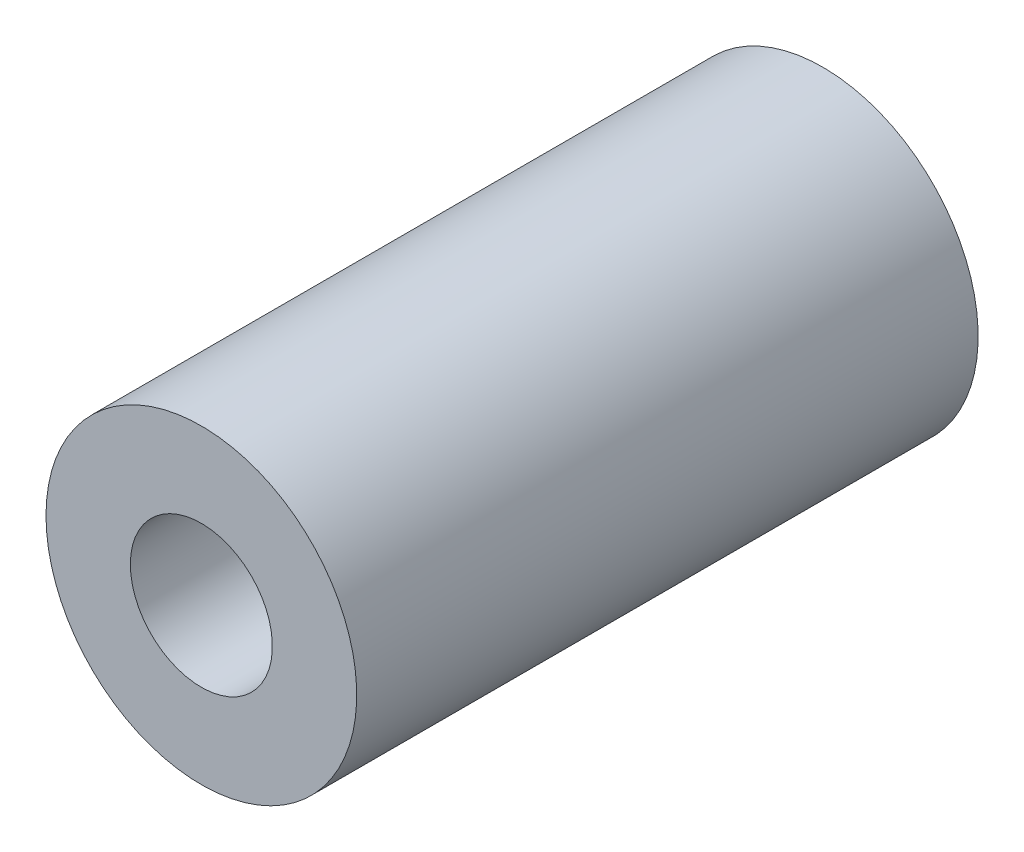
ISO-10303-21;
HEADER;
FILE_DESCRIPTION(('STEP AP214'),'2;1');
FILE_NAME('part.step','',(''),(''),'','','');
FILE_SCHEMA(('AUTOMOTIVE_DESIGN { 1 0 10303 214 1 1 1 1 }'));
ENDSEC;
DATA;
#1=APPLICATION_CONTEXT('core data for automotive mechanical design processes');
#2=APPLICATION_PROTOCOL_DEFINITION('international standard','automotive_design',2000,#1);
#3=PRODUCT_CONTEXT('',#1,'mechanical');
#4=PRODUCT('Part','Part','',(#3));
#5=PRODUCT_RELATED_PRODUCT_CATEGORY('part','',(#4));
#6=PRODUCT_DEFINITION_FORMATION('','',#4);
#7=PRODUCT_DEFINITION_CONTEXT('part definition',#1,'design');
#8=PRODUCT_DEFINITION('design','',#6,#7);
#9=PRODUCT_DEFINITION_SHAPE('','',#8);
#10=(LENGTH_UNIT() NAMED_UNIT(*) SI_UNIT(.MILLI.,.METRE.));
#11=(NAMED_UNIT(*) PLANE_ANGLE_UNIT() SI_UNIT($,.RADIAN.));
#12=(NAMED_UNIT(*) SI_UNIT($,.STERADIAN.) SOLID_ANGLE_UNIT());
#13=UNCERTAINTY_MEASURE_WITH_UNIT(LENGTH_MEASURE(1.E-05),#10,'distance_accuracy_value','');
#14=(GEOMETRIC_REPRESENTATION_CONTEXT(3) GLOBAL_UNCERTAINTY_ASSIGNED_CONTEXT((#13)) GLOBAL_UNIT_ASSIGNED_CONTEXT((#10,
#11,#12)) REPRESENTATION_CONTEXT('',''));
#15=CARTESIAN_POINT('',(0.,0.,0.));
#16=DIRECTION('',(0.,0.,1.));
#17=DIRECTION('',(1.,0.,0.));
#18=AXIS2_PLACEMENT_3D('',#15,#16,#17);
#19=CARTESIAN_POINT('',(0.,0.,0.));
#20=DIRECTION('',(0.,0.,1.));
#21=DIRECTION('',(1.,0.,0.));
#22=AXIS2_PLACEMENT_3D('',#19,#20,#21);
#23=PLANE('',#22);
#24=CARTESIAN_POINT('',(0.,0.,0.));
#25=DIRECTION('',(0.,0.,-1.));
#26=DIRECTION('',(1.,0.,0.));
#27=AXIS2_PLACEMENT_3D('',#24,#25,#26);
#28=CIRCLE('',#27,1.6);
#29=CARTESIAN_POINT('',(-1.6,0.,0.));
#30=VERTEX_POINT('',#29);
#31=EDGE_CURVE('E55',#30,#30,#28,.T.);
#32=ORIENTED_EDGE('',*,*,#31,.F.);
#33=EDGE_LOOP('',(#32));
#34=FACE_BOUND('',#33,.T.);
#35=CARTESIAN_POINT('',(0.,0.,0.));
#36=DIRECTION('',(0.,0.,1.));
#37=DIRECTION('',(1.,0.,0.));
#38=AXIS2_PLACEMENT_3D('',#35,#36,#37);
#39=CIRCLE('',#38,3.5);
#40=CARTESIAN_POINT('',(-3.5,0.,0.));
#41=VERTEX_POINT('',#40);
#42=EDGE_CURVE('E11',#41,#41,#39,.T.);
#43=ORIENTED_EDGE('',*,*,#42,.F.);
#44=EDGE_LOOP('',(#43));
#45=FACE_BOUND('',#44,.T.);
#46=ADVANCED_FACE('F16',(#34,#45),#23,.F.);
#47=CARTESIAN_POINT('',(0.,0.,14.));
#48=DIRECTION('',(0.,0.,1.));
#49=DIRECTION('',(1.,0.,0.));
#50=AXIS2_PLACEMENT_3D('',#47,#48,#49);
#51=PLANE('',#50);
#52=CARTESIAN_POINT('',(0.,0.,14.));
#53=DIRECTION('',(0.,0.,-1.));
#54=DIRECTION('',(1.,0.,0.));
#55=AXIS2_PLACEMENT_3D('',#52,#53,#54);
#56=CIRCLE('',#55,1.6);
#57=CARTESIAN_POINT('',(-1.6,0.,14.));
#58=VERTEX_POINT('',#57);
#59=EDGE_CURVE('E56',#58,#58,#56,.T.);
#60=ORIENTED_EDGE('',*,*,#59,.T.);
#61=EDGE_LOOP('',(#60));
#62=FACE_BOUND('',#61,.T.);
#63=CARTESIAN_POINT('',(0.,0.,14.));
#64=DIRECTION('',(0.,0.,1.));
#65=DIRECTION('',(1.,0.,0.));
#66=AXIS2_PLACEMENT_3D('',#63,#64,#65);
#67=CIRCLE('',#66,3.5);
#68=CARTESIAN_POINT('',(-3.5,0.,14.));
#69=VERTEX_POINT('',#68);
#70=EDGE_CURVE('E64',#69,#69,#67,.T.);
#71=ORIENTED_EDGE('',*,*,#70,.T.);
#72=EDGE_LOOP('',(#71));
#73=FACE_BOUND('',#72,.T.);
#74=ADVANCED_FACE('F74',(#62,#73),#51,.T.);
#75=CARTESIAN_POINT('',(0.,0.,0.));
#76=DIRECTION('',(0.,0.,1.));
#77=DIRECTION('',(1.,0.,0.));
#78=AXIS2_PLACEMENT_3D('',#75,#76,#77);
#79=CYLINDRICAL_SURFACE('',#78,3.5);
#80=ORIENTED_EDGE('',*,*,#70,.F.);
#81=DIRECTION('',(0.,0.,-1.));
#82=VECTOR('',#81,1.);
#83=CARTESIAN_POINT('',(-3.5,0.,0.));
#84=LINE('',#83,#82);
#85=EDGE_CURVE('E24',#69,#41,#84,.T.);
#86=ORIENTED_EDGE('',*,*,#85,.T.);
#87=ORIENTED_EDGE('',*,*,#42,.T.);
#88=ORIENTED_EDGE('',*,*,#85,.F.);
#89=EDGE_LOOP('',(#80,#86,#87,#88));
#90=FACE_BOUND('',#89,.T.);
#91=ADVANCED_FACE('F72',(#90),#79,.T.);
#92=CARTESIAN_POINT('',(0.,0.,0.));
#93=DIRECTION('',(0.,0.,1.));
#94=DIRECTION('',(1.,0.,0.));
#95=AXIS2_PLACEMENT_3D('',#92,#93,#94);
#96=CYLINDRICAL_SURFACE('',#95,1.6);
#97=ORIENTED_EDGE('',*,*,#31,.T.);
#98=DIRECTION('',(0.,0.,1.));
#99=VECTOR('',#98,1.);
#100=CARTESIAN_POINT('',(-1.6,0.,0.));
#101=LINE('',#100,#99);
#102=EDGE_CURVE('E52',#30,#58,#101,.T.);
#103=ORIENTED_EDGE('',*,*,#102,.T.);
#104=ORIENTED_EDGE('',*,*,#59,.F.);
#105=ORIENTED_EDGE('',*,*,#102,.F.);
#106=EDGE_LOOP('',(#97,#103,#104,#105));
#107=FACE_BOUND('',#106,.T.);
#108=ADVANCED_FACE('F53',(#107),#96,.F.);
#109=CLOSED_SHELL('',(#46,#74,#91,#108));
#110=MANIFOLD_SOLID_BREP('B1',#109);
#111=ADVANCED_BREP_SHAPE_REPRESENTATION('',(#18,#110),#14);
#112=SHAPE_DEFINITION_REPRESENTATION(#9,#111);
ENDSEC;
END-ISO-10303-21;
